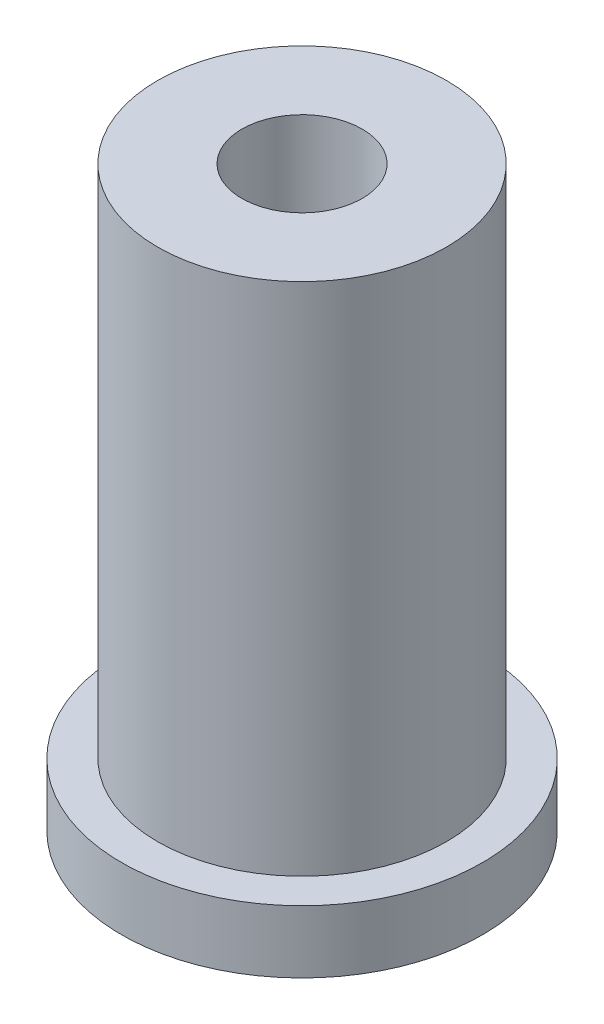
ISO-10303-21;
HEADER;
FILE_DESCRIPTION(('STEP AP214'),'2;1');
FILE_NAME('part.step','',(''),(''),'','','');
FILE_SCHEMA(('AUTOMOTIVE_DESIGN { 1 0 10303 214 1 1 1 1 }'));
ENDSEC;
DATA;
#1=APPLICATION_CONTEXT('core data for automotive mechanical design processes');
#2=APPLICATION_PROTOCOL_DEFINITION('international standard','automotive_design',2000,#1);
#3=PRODUCT_CONTEXT('',#1,'mechanical');
#4=PRODUCT('Part','Part','',(#3));
#5=PRODUCT_RELATED_PRODUCT_CATEGORY('part','',(#4));
#6=PRODUCT_DEFINITION_FORMATION('','',#4);
#7=PRODUCT_DEFINITION_CONTEXT('part definition',#1,'design');
#8=PRODUCT_DEFINITION('design','',#6,#7);
#9=PRODUCT_DEFINITION_SHAPE('','',#8);
#10=(LENGTH_UNIT() NAMED_UNIT(*) SI_UNIT(.MILLI.,.METRE.));
#11=(NAMED_UNIT(*) PLANE_ANGLE_UNIT() SI_UNIT($,.RADIAN.));
#12=(NAMED_UNIT(*) SI_UNIT($,.STERADIAN.) SOLID_ANGLE_UNIT());
#13=UNCERTAINTY_MEASURE_WITH_UNIT(LENGTH_MEASURE(1.E-05),#10,'distance_accuracy_value','');
#14=(GEOMETRIC_REPRESENTATION_CONTEXT(3) GLOBAL_UNCERTAINTY_ASSIGNED_CONTEXT((#13)) GLOBAL_UNIT_ASSIGNED_CONTEXT((#10,
#11,#12)) REPRESENTATION_CONTEXT('',''));
#15=CARTESIAN_POINT('',(0.,0.,0.));
#16=DIRECTION('',(0.,0.,1.));
#17=DIRECTION('',(1.,0.,0.));
#18=AXIS2_PLACEMENT_3D('',#15,#16,#17);
#19=CARTESIAN_POINT('',(0.,1.651,0.));
#20=DIRECTION('',(0.,1.,0.));
#21=DIRECTION('',(0.,0.,1.));
#22=AXIS2_PLACEMENT_3D('',#19,#20,#21);
#23=PLANE('',#22);
#24=CARTESIAN_POINT('',(0.,1.651,0.));
#25=DIRECTION('',(0.,1.,0.));
#26=DIRECTION('',(0.,0.,1.));
#27=AXIS2_PLACEMENT_3D('',#24,#25,#26);
#28=CIRCLE('',#27,4.7625);
#29=CARTESIAN_POINT('',(0.,1.651,-4.7625));
#30=VERTEX_POINT('',#29);
#31=EDGE_CURVE('E10',#30,#30,#28,.T.);
#32=ORIENTED_EDGE('',*,*,#31,.T.);
#33=EDGE_LOOP('',(#32));
#34=FACE_BOUND('',#33,.T.);
#35=CARTESIAN_POINT('',(0.,1.651,0.));
#36=DIRECTION('',(0.,1.,0.));
#37=DIRECTION('',(0.,0.,1.));
#38=AXIS2_PLACEMENT_3D('',#35,#36,#37);
#39=CIRCLE('',#38,3.81);
#40=CARTESIAN_POINT('',(0.,1.651,3.81));
#41=VERTEX_POINT('',#40);
#42=EDGE_CURVE('E43',#41,#41,#39,.T.);
#43=ORIENTED_EDGE('',*,*,#42,.F.);
#44=EDGE_LOOP('',(#43));
#45=FACE_BOUND('',#44,.T.);
#46=ADVANCED_FACE('F30',(#34,#45),#23,.T.);
#47=CARTESIAN_POINT('',(0.,1.651,0.));
#48=DIRECTION('',(0.,-1.,0.));
#49=DIRECTION('',(0.,0.,-1.));
#50=AXIS2_PLACEMENT_3D('',#47,#48,#49);
#51=CYLINDRICAL_SURFACE('',#50,4.7625);
#52=CARTESIAN_POINT('',(0.,0.,0.));
#53=DIRECTION('',(0.,1.,0.));
#54=DIRECTION('',(0.,0.,1.));
#55=AXIS2_PLACEMENT_3D('',#52,#53,#54);
#56=CIRCLE('',#55,4.7625);
#57=CARTESIAN_POINT('',(0.,0.,-4.7625));
#58=VERTEX_POINT('',#57);
#59=EDGE_CURVE('E34',#58,#58,#56,.T.);
#60=CARTESIAN_POINT('',(0.,1.651,-4.7625));
#61=CARTESIAN_POINT('',(0.,1.63380208333333,-4.7625));
#62=CARTESIAN_POINT('',(0.,1.61660416666667,-4.7625));
#63=CARTESIAN_POINT('',(0.,1.58220833333333,-4.7625));
#64=CARTESIAN_POINT('',(0.,1.56501041666667,-4.7625));
#65=CARTESIAN_POINT('',(0.,1.53061458333333,-4.7625));
#66=CARTESIAN_POINT('',(0.,1.51341666666667,-4.7625));
#67=CARTESIAN_POINT('',(0.,1.47902083333333,-4.7625));
#68=CARTESIAN_POINT('',(0.,1.46182291666667,-4.7625));
#69=CARTESIAN_POINT('',(0.,1.42742708333333,-4.7625));
#70=CARTESIAN_POINT('',(0.,1.41022916666667,-4.7625));
#71=CARTESIAN_POINT('',(0.,1.37583333333333,-4.7625));
#72=CARTESIAN_POINT('',(0.,1.35863541666667,-4.7625));
#73=CARTESIAN_POINT('',(0.,1.32423958333333,-4.7625));
#74=CARTESIAN_POINT('',(0.,1.30704166666667,-4.7625));
#75=CARTESIAN_POINT('',(0.,1.27264583333333,-4.7625));
#76=CARTESIAN_POINT('',(0.,1.25544791666667,-4.7625));
#77=CARTESIAN_POINT('',(0.,1.22105208333333,-4.7625));
#78=CARTESIAN_POINT('',(0.,1.20385416666667,-4.7625));
#79=CARTESIAN_POINT('',(0.,1.16945833333333,-4.7625));
#80=CARTESIAN_POINT('',(0.,1.15226041666667,-4.7625));
#81=CARTESIAN_POINT('',(0.,1.11786458333333,-4.7625));
#82=CARTESIAN_POINT('',(0.,1.10066666666667,-4.7625));
#83=CARTESIAN_POINT('',(0.,1.06627083333333,-4.7625));
#84=CARTESIAN_POINT('',(0.,1.04907291666667,-4.7625));
#85=CARTESIAN_POINT('',(0.,1.01467708333333,-4.7625));
#86=CARTESIAN_POINT('',(0.,0.997479166666666,-4.7625));
#87=CARTESIAN_POINT('',(0.,0.963083333333333,-4.7625));
#88=CARTESIAN_POINT('',(0.,0.945885416666666,-4.7625));
#89=CARTESIAN_POINT('',(0.,0.911489583333333,-4.7625));
#90=CARTESIAN_POINT('',(0.,0.894291666666666,-4.7625));
#91=CARTESIAN_POINT('',(0.,0.859895833333333,-4.7625));
#92=CARTESIAN_POINT('',(0.,0.842697916666666,-4.7625));
#93=CARTESIAN_POINT('',(0.,0.808302083333333,-4.7625));
#94=CARTESIAN_POINT('',(0.,0.791104166666666,-4.7625));
#95=CARTESIAN_POINT('',(0.,0.756708333333333,-4.7625));
#96=CARTESIAN_POINT('',(0.,0.739510416666667,-4.7625));
#97=CARTESIAN_POINT('',(0.,0.705114583333333,-4.7625));
#98=CARTESIAN_POINT('',(0.,0.687916666666667,-4.7625));
#99=CARTESIAN_POINT('',(0.,0.653520833333333,-4.7625));
#100=CARTESIAN_POINT('',(0.,0.636322916666667,-4.7625));
#101=CARTESIAN_POINT('',(0.,0.601927083333333,-4.7625));
#102=CARTESIAN_POINT('',(0.,0.584729166666667,-4.7625));
#103=CARTESIAN_POINT('',(0.,0.550333333333333,-4.7625));
#104=CARTESIAN_POINT('',(0.,0.533135416666667,-4.7625));
#105=CARTESIAN_POINT('',(0.,0.498739583333333,-4.7625));
#106=CARTESIAN_POINT('',(0.,0.481541666666667,-4.7625));
#107=CARTESIAN_POINT('',(0.,0.447145833333333,-4.7625));
#108=CARTESIAN_POINT('',(0.,0.429947916666667,-4.7625));
#109=CARTESIAN_POINT('',(0.,0.395552083333333,-4.7625));
#110=CARTESIAN_POINT('',(0.,0.378354166666667,-4.7625));
#111=CARTESIAN_POINT('',(0.,0.343958333333333,-4.7625));
#112=CARTESIAN_POINT('',(0.,0.326760416666667,-4.7625));
#113=CARTESIAN_POINT('',(0.,0.292364583333333,-4.7625));
#114=CARTESIAN_POINT('',(0.,0.275166666666667,-4.7625));
#115=CARTESIAN_POINT('',(0.,0.240770833333333,-4.7625));
#116=CARTESIAN_POINT('',(0.,0.223572916666667,-4.7625));
#117=CARTESIAN_POINT('',(0.,0.189177083333333,-4.7625));
#118=CARTESIAN_POINT('',(0.,0.171979166666667,-4.7625));
#119=CARTESIAN_POINT('',(0.,0.137583333333333,-4.7625));
#120=CARTESIAN_POINT('',(0.,0.120385416666667,-4.7625));
#121=CARTESIAN_POINT('',(0.,0.0859895833333333,-4.7625));
#122=CARTESIAN_POINT('',(0.,0.0687916666666667,-4.7625));
#123=CARTESIAN_POINT('',(0.,0.0343958333333333,-4.7625));
#124=CARTESIAN_POINT('',(0.,0.0171979166666666,-4.7625));
#125=CARTESIAN_POINT('',(0.,0.,-4.7625));
#126=B_SPLINE_CURVE_WITH_KNOTS('',3,(#60,#61,#62,#63,#64,#65,#66,#67,#68,#69,#70,#71,#72,#73,
#74,#75,#76,#77,#78,#79,#80,#81,#82,#83,#84,#85,#86,#87,#88,#89,#90,#91,#92,#93,#94,#95,#96,#97,
#98,#99,#100,#101,#102,#103,#104,#105,#106,#107,#108,#109,#110,#111,#112,#113,#114,#115,#116,
#117,#118,#119,#120,#121,#122,#123,#124,#125),.UNSPECIFIED.,.F.,.F.,(4,2,2,2,2,2,2,2,2,2,2,2,2,
2,2,2,2,2,2,2,2,2,2,2,2,2,2,2,2,2,2,2,4),(0.,0.0515937500000002,0.1031875,0.15478125,0.206375,
0.25796875,0.3095625,0.36115625,0.41275,0.46434375,0.5159375,0.56753125,0.619125,0.67071875,
0.7223125,0.77390625,0.8255,0.87709375,0.9286875,0.98028125,1.031875,1.08346875,1.1350625,
1.18665625,1.23825,1.28984375,1.3414375,1.39303125,1.444625,1.49621875,1.5478125,1.59940625,
1.651),.UNSPECIFIED.);
#127=EDGE_CURVE('BSEAM32',#30,#58,#126,.T.);
#128=ORIENTED_EDGE('',*,*,#31,.F.);
#129=ORIENTED_EDGE('',*,*,#59,.T.);
#130=ORIENTED_EDGE('',*,*,#127,.T.);
#131=ORIENTED_EDGE('',*,*,#127,.F.);
#132=EDGE_LOOP('',(#128,#130,#129,#131));
#133=FACE_BOUND('',#132,.T.);
#134=ADVANCED_FACE('F32',(#133),#51,.T.);
#135=CARTESIAN_POINT('',(0.,0.,0.));
#136=DIRECTION('',(0.,1.,0.));
#137=DIRECTION('',(0.,0.,1.));
#138=AXIS2_PLACEMENT_3D('',#135,#136,#137);
#139=PLANE('',#138);
#140=CARTESIAN_POINT('',(0.,0.,0.));
#141=DIRECTION('',(0.,-1.,0.));
#142=DIRECTION('',(0.,0.,-1.));
#143=AXIS2_PLACEMENT_3D('',#140,#141,#142);
#144=CIRCLE('',#143,1.5875);
#145=CARTESIAN_POINT('',(0.,0.,-1.5875));
#146=VERTEX_POINT('',#145);
#147=EDGE_CURVE('E49',#146,#146,#144,.T.);
#148=ORIENTED_EDGE('',*,*,#147,.F.);
#149=EDGE_LOOP('',(#148));
#150=FACE_BOUND('',#149,.T.);
#151=ORIENTED_EDGE('',*,*,#59,.F.);
#152=EDGE_LOOP('',(#151));
#153=FACE_BOUND('',#152,.T.);
#154=ADVANCED_FACE('F64',(#150,#153),#139,.F.);
#155=CARTESIAN_POINT('',(0.,15.24,0.));
#156=DIRECTION('',(0.,-1.,0.));
#157=DIRECTION('',(0.,0.,-1.));
#158=AXIS2_PLACEMENT_3D('',#155,#156,#157);
#159=CYLINDRICAL_SURFACE('',#158,3.81);
#160=CARTESIAN_POINT('',(0.,15.24,0.));
#161=DIRECTION('',(0.,1.,0.));
#162=DIRECTION('',(0.,0.,1.));
#163=AXIS2_PLACEMENT_3D('',#160,#161,#162);
#164=CIRCLE('',#163,3.81);
#165=CARTESIAN_POINT('',(0.,15.24,3.81));
#166=VERTEX_POINT('',#165);
#167=EDGE_CURVE('E41',#166,#166,#164,.T.);
#168=ORIENTED_EDGE('',*,*,#167,.F.);
#169=EDGE_LOOP('',(#168));
#170=FACE_BOUND('',#169,.T.);
#171=ORIENTED_EDGE('',*,*,#42,.T.);
#172=EDGE_LOOP('',(#171));
#173=FACE_BOUND('',#172,.T.);
#174=ADVANCED_FACE('F67',(#170,#173),#159,.T.);
#175=CARTESIAN_POINT('',(0.,15.24,0.));
#176=DIRECTION('',(0.,1.,0.));
#177=DIRECTION('',(0.,0.,1.));
#178=AXIS2_PLACEMENT_3D('',#175,#176,#177);
#179=PLANE('',#178);
#180=CARTESIAN_POINT('',(0.,15.24,0.));
#181=DIRECTION('',(0.,-1.,0.));
#182=DIRECTION('',(0.,0.,-1.));
#183=AXIS2_PLACEMENT_3D('',#180,#181,#182);
#184=CIRCLE('',#183,1.5875);
#185=CARTESIAN_POINT('',(0.,15.24,-1.5875));
#186=VERTEX_POINT('',#185);
#187=EDGE_CURVE('E46',#186,#186,#184,.T.);
#188=ORIENTED_EDGE('',*,*,#187,.T.);
#189=EDGE_LOOP('',(#188));
#190=FACE_BOUND('',#189,.T.);
#191=ORIENTED_EDGE('',*,*,#167,.T.);
#192=EDGE_LOOP('',(#191));
#193=FACE_BOUND('',#192,.T.);
#194=ADVANCED_FACE('F55',(#190,#193),#179,.T.);
#195=CARTESIAN_POINT('',(0.,15.24,0.));
#196=DIRECTION('',(0.,-1.,0.));
#197=DIRECTION('',(0.,0.,-1.));
#198=AXIS2_PLACEMENT_3D('',#195,#196,#197);
#199=CYLINDRICAL_SURFACE('',#198,1.5875);
#200=ORIENTED_EDGE('',*,*,#187,.F.);
#201=EDGE_LOOP('',(#200));
#202=FACE_BOUND('',#201,.T.);
#203=ORIENTED_EDGE('',*,*,#147,.T.);
#204=EDGE_LOOP('',(#203));
#205=FACE_BOUND('',#204,.T.);
#206=ADVANCED_FACE('F58',(#202,#205),#199,.F.);
#207=CLOSED_SHELL('',(#46,#134,#154,#174,#194,#206));
#208=MANIFOLD_SOLID_BREP('B2',#207);
#209=ADVANCED_BREP_SHAPE_REPRESENTATION('',(#18,#208),#14);
#210=SHAPE_DEFINITION_REPRESENTATION(#9,#209);
ENDSEC;
END-ISO-10303-21;
